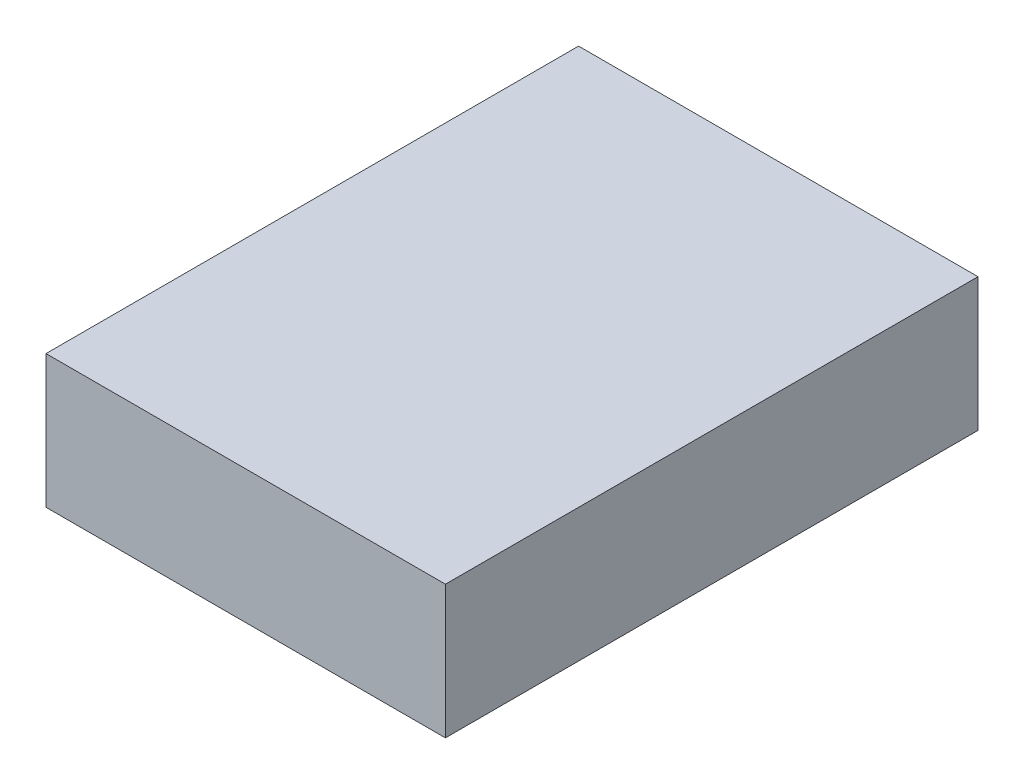
ISO-10303-21;
HEADER;
FILE_DESCRIPTION(('STEP AP214'),'2;1');
FILE_NAME('part.step','',(''),(''),'','','');
FILE_SCHEMA(('AUTOMOTIVE_DESIGN { 1 0 10303 214 1 1 1 1 }'));
ENDSEC;
DATA;
#1=APPLICATION_CONTEXT('core data for automotive mechanical design processes');
#2=APPLICATION_PROTOCOL_DEFINITION('international standard','automotive_design',2000,#1);
#3=PRODUCT_CONTEXT('',#1,'mechanical');
#4=PRODUCT('Part','Part','',(#3));
#5=PRODUCT_RELATED_PRODUCT_CATEGORY('part','',(#4));
#6=PRODUCT_DEFINITION_FORMATION('','',#4);
#7=PRODUCT_DEFINITION_CONTEXT('part definition',#1,'design');
#8=PRODUCT_DEFINITION('design','',#6,#7);
#9=PRODUCT_DEFINITION_SHAPE('','',#8);
#10=(LENGTH_UNIT() NAMED_UNIT(*) SI_UNIT(.MILLI.,.METRE.));
#11=(NAMED_UNIT(*) PLANE_ANGLE_UNIT() SI_UNIT($,.RADIAN.));
#12=(NAMED_UNIT(*) SI_UNIT($,.STERADIAN.) SOLID_ANGLE_UNIT());
#13=UNCERTAINTY_MEASURE_WITH_UNIT(LENGTH_MEASURE(1.E-05),#10,'distance_accuracy_value','');
#14=(GEOMETRIC_REPRESENTATION_CONTEXT(3) GLOBAL_UNCERTAINTY_ASSIGNED_CONTEXT((#13)) GLOBAL_UNIT_ASSIGNED_CONTEXT((#10,
#11,#12)) REPRESENTATION_CONTEXT('',''));
#15=CARTESIAN_POINT('',(0.,0.,0.));
#16=DIRECTION('',(0.,0.,1.));
#17=DIRECTION('',(1.,0.,0.));
#18=AXIS2_PLACEMENT_3D('',#15,#16,#17);
#19=CARTESIAN_POINT('',(30.,20.,-40.));
#20=DIRECTION('',(0.,0.,1.));
#21=DIRECTION('',(1.,0.,0.));
#22=AXIS2_PLACEMENT_3D('',#19,#20,#21);
#23=PLANE('',#22);
#24=DIRECTION('',(-1.,0.,0.));
#25=VECTOR('',#24,1.);
#26=CARTESIAN_POINT('',(30.,0.,-40.));
#27=LINE('',#26,#25);
#28=CARTESIAN_POINT('',(30.,0.,-40.));
#29=VERTEX_POINT('',#28);
#30=CARTESIAN_POINT('',(-30.,0.,-40.));
#31=VERTEX_POINT('',#30);
#32=EDGE_CURVE('E100',#29,#31,#27,.T.);
#33=ORIENTED_EDGE('',*,*,#32,.T.);
#34=DIRECTION('',(0.,-1.,0.));
#35=VECTOR('',#34,1.);
#36=CARTESIAN_POINT('',(-30.,20.,-40.));
#37=LINE('',#36,#35);
#38=CARTESIAN_POINT('',(-30.,20.,-40.));
#39=VERTEX_POINT('',#38);
#40=EDGE_CURVE('E11',#39,#31,#37,.T.);
#41=ORIENTED_EDGE('',*,*,#40,.F.);
#42=DIRECTION('',(-1.,0.,0.));
#43=VECTOR('',#42,1.);
#44=CARTESIAN_POINT('',(30.,20.,-40.));
#45=LINE('',#44,#43);
#46=CARTESIAN_POINT('',(30.,20.,-40.));
#47=VERTEX_POINT('',#46);
#48=EDGE_CURVE('E86',#47,#39,#45,.T.);
#49=ORIENTED_EDGE('',*,*,#48,.F.);
#50=DIRECTION('',(0.,-1.,0.));
#51=VECTOR('',#50,1.);
#52=CARTESIAN_POINT('',(30.,20.,-40.));
#53=LINE('',#52,#51);
#54=EDGE_CURVE('E53',#47,#29,#53,.T.);
#55=ORIENTED_EDGE('',*,*,#54,.T.);
#56=EDGE_LOOP('',(#33,#41,#49,#55));
#57=FACE_BOUND('',#56,.T.);
#58=ADVANCED_FACE('F37',(#57),#23,.F.);
#59=CARTESIAN_POINT('',(-30.,20.,-40.));
#60=DIRECTION('',(1.,0.,0.));
#61=DIRECTION('',(0.,0.,-1.));
#62=AXIS2_PLACEMENT_3D('',#59,#60,#61);
#63=PLANE('',#62);
#64=DIRECTION('',(0.,0.,1.));
#65=VECTOR('',#64,1.);
#66=CARTESIAN_POINT('',(-30.,0.,-40.));
#67=LINE('',#66,#65);
#68=CARTESIAN_POINT('',(-30.,0.,40.));
#69=VERTEX_POINT('',#68);
#70=EDGE_CURVE('E91',#31,#69,#67,.T.);
#71=ORIENTED_EDGE('',*,*,#70,.T.);
#72=DIRECTION('',(0.,-1.,0.));
#73=VECTOR('',#72,1.);
#74=CARTESIAN_POINT('',(-30.,20.,40.));
#75=LINE('',#74,#73);
#76=CARTESIAN_POINT('',(-30.,20.,40.));
#77=VERTEX_POINT('',#76);
#78=EDGE_CURVE('E45',#77,#69,#75,.T.);
#79=ORIENTED_EDGE('',*,*,#78,.F.);
#80=DIRECTION('',(0.,0.,1.));
#81=VECTOR('',#80,1.);
#82=CARTESIAN_POINT('',(-30.,20.,-40.));
#83=LINE('',#82,#81);
#84=EDGE_CURVE('E78',#39,#77,#83,.T.);
#85=ORIENTED_EDGE('',*,*,#84,.F.);
#86=ORIENTED_EDGE('',*,*,#40,.T.);
#87=EDGE_LOOP('',(#71,#79,#85,#86));
#88=FACE_BOUND('',#87,.T.);
#89=ADVANCED_FACE('F90',(#88),#63,.F.);
#90=CARTESIAN_POINT('',(30.,20.,40.));
#91=DIRECTION('',(0.,0.,1.));
#92=DIRECTION('',(1.,0.,0.));
#93=AXIS2_PLACEMENT_3D('',#90,#91,#92);
#94=PLANE('',#93);
#95=DIRECTION('',(-1.,0.,0.));
#96=VECTOR('',#95,1.);
#97=CARTESIAN_POINT('',(30.,0.,40.));
#98=LINE('',#97,#96);
#99=CARTESIAN_POINT('',(30.,0.,40.));
#100=VERTEX_POINT('',#99);
#101=EDGE_CURVE('E103',#100,#69,#98,.T.);
#102=ORIENTED_EDGE('',*,*,#101,.F.);
#103=DIRECTION('',(0.,-1.,0.));
#104=VECTOR('',#103,1.);
#105=CARTESIAN_POINT('',(30.,20.,40.));
#106=LINE('',#105,#104);
#107=CARTESIAN_POINT('',(30.,20.,40.));
#108=VERTEX_POINT('',#107);
#109=EDGE_CURVE('E67',#108,#100,#106,.T.);
#110=ORIENTED_EDGE('',*,*,#109,.F.);
#111=DIRECTION('',(-1.,0.,0.));
#112=VECTOR('',#111,1.);
#113=CARTESIAN_POINT('',(30.,20.,40.));
#114=LINE('',#113,#112);
#115=EDGE_CURVE('E85',#108,#77,#114,.T.);
#116=ORIENTED_EDGE('',*,*,#115,.T.);
#117=ORIENTED_EDGE('',*,*,#78,.T.);
#118=EDGE_LOOP('',(#102,#110,#116,#117));
#119=FACE_BOUND('',#118,.T.);
#120=ADVANCED_FACE('F94',(#119),#94,.T.);
#121=CARTESIAN_POINT('',(30.,20.,-40.));
#122=DIRECTION('',(1.,0.,0.));
#123=DIRECTION('',(0.,0.,-1.));
#124=AXIS2_PLACEMENT_3D('',#121,#122,#123);
#125=PLANE('',#124);
#126=DIRECTION('',(0.,0.,1.));
#127=VECTOR('',#126,1.);
#128=CARTESIAN_POINT('',(30.,0.,-40.));
#129=LINE('',#128,#127);
#130=EDGE_CURVE('E105',#29,#100,#129,.T.);
#131=ORIENTED_EDGE('',*,*,#130,.F.);
#132=ORIENTED_EDGE('',*,*,#54,.F.);
#133=DIRECTION('',(0.,0.,1.));
#134=VECTOR('',#133,1.);
#135=CARTESIAN_POINT('',(30.,20.,-40.));
#136=LINE('',#135,#134);
#137=EDGE_CURVE('E95',#47,#108,#136,.T.);
#138=ORIENTED_EDGE('',*,*,#137,.T.);
#139=ORIENTED_EDGE('',*,*,#109,.T.);
#140=EDGE_LOOP('',(#131,#132,#138,#139));
#141=FACE_BOUND('',#140,.T.);
#142=ADVANCED_FACE('F111',(#141),#125,.T.);
#143=CARTESIAN_POINT('',(0.,20.,0.));
#144=DIRECTION('',(0.,1.,0.));
#145=DIRECTION('',(0.,0.,1.));
#146=AXIS2_PLACEMENT_3D('',#143,#144,#145);
#147=PLANE('',#146);
#148=ORIENTED_EDGE('',*,*,#48,.T.);
#149=ORIENTED_EDGE('',*,*,#84,.T.);
#150=ORIENTED_EDGE('',*,*,#115,.F.);
#151=ORIENTED_EDGE('',*,*,#137,.F.);
#152=EDGE_LOOP('',(#148,#149,#150,#151));
#153=FACE_BOUND('',#152,.T.);
#154=ADVANCED_FACE('F82',(#153),#147,.T.);
#155=CARTESIAN_POINT('',(0.,0.,0.));
#156=DIRECTION('',(0.,1.,0.));
#157=DIRECTION('',(0.,0.,1.));
#158=AXIS2_PLACEMENT_3D('',#155,#156,#157);
#159=PLANE('',#158);
#160=ORIENTED_EDGE('',*,*,#32,.F.);
#161=ORIENTED_EDGE('',*,*,#130,.T.);
#162=ORIENTED_EDGE('',*,*,#101,.T.);
#163=ORIENTED_EDGE('',*,*,#70,.F.);
#164=EDGE_LOOP('',(#160,#161,#162,#163));
#165=FACE_BOUND('',#164,.T.);
#166=ADVANCED_FACE('F110',(#165),#159,.F.);
#167=CLOSED_SHELL('',(#58,#89,#120,#142,#154,#166));
#168=MANIFOLD_SOLID_BREP('B2',#167);
#169=ADVANCED_BREP_SHAPE_REPRESENTATION('',(#18,#168),#14);
#170=SHAPE_DEFINITION_REPRESENTATION(#9,#169);
ENDSEC;
END-ISO-10303-21;
